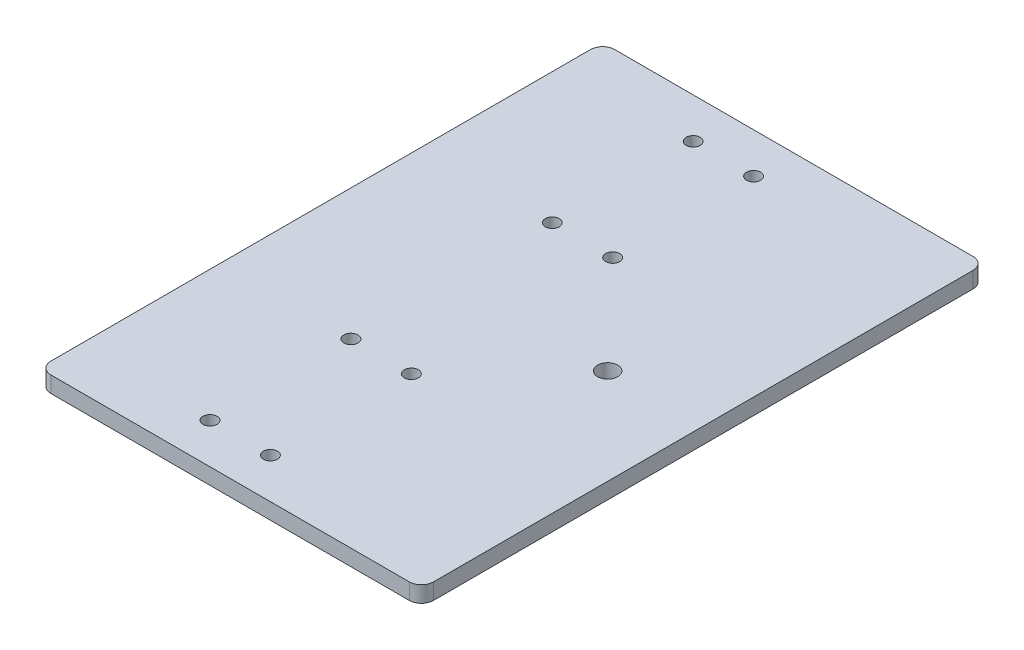
ISO-10303-21;
HEADER;
FILE_DESCRIPTION(('STEP AP214'),'2;1');
FILE_NAME('part.step','',(''),(''),'','','');
FILE_SCHEMA(('AUTOMOTIVE_DESIGN { 1 0 10303 214 1 1 1 1 }'));
ENDSEC;
DATA;
#1=APPLICATION_CONTEXT('core data for automotive mechanical design processes');
#2=APPLICATION_PROTOCOL_DEFINITION('international standard','automotive_design',2000,#1);
#3=PRODUCT_CONTEXT('',#1,'mechanical');
#4=PRODUCT('Part','Part','',(#3));
#5=PRODUCT_RELATED_PRODUCT_CATEGORY('part','',(#4));
#6=PRODUCT_DEFINITION_FORMATION('','',#4);
#7=PRODUCT_DEFINITION_CONTEXT('part definition',#1,'design');
#8=PRODUCT_DEFINITION('design','',#6,#7);
#9=PRODUCT_DEFINITION_SHAPE('','',#8);
#10=(LENGTH_UNIT() NAMED_UNIT(*) SI_UNIT(.MILLI.,.METRE.));
#11=(NAMED_UNIT(*) PLANE_ANGLE_UNIT() SI_UNIT($,.RADIAN.));
#12=(NAMED_UNIT(*) SI_UNIT($,.STERADIAN.) SOLID_ANGLE_UNIT());
#13=UNCERTAINTY_MEASURE_WITH_UNIT(LENGTH_MEASURE(1.E-05),#10,'distance_accuracy_value','');
#14=(GEOMETRIC_REPRESENTATION_CONTEXT(3) GLOBAL_UNCERTAINTY_ASSIGNED_CONTEXT((#13)) GLOBAL_UNIT_ASSIGNED_CONTEXT((#10,
#11,#12)) REPRESENTATION_CONTEXT('',''));
#15=CARTESIAN_POINT('',(0.,0.,0.));
#16=DIRECTION('',(0.,0.,1.));
#17=DIRECTION('',(1.,0.,0.));
#18=AXIS2_PLACEMENT_3D('',#15,#16,#17);
#19=CARTESIAN_POINT('',(0.,4.,0.));
#20=DIRECTION('',(0.,1.,0.));
#21=DIRECTION('',(0.,0.,1.));
#22=AXIS2_PLACEMENT_3D('',#19,#20,#21);
#23=PLANE('',#22);
#24=CARTESIAN_POINT('',(-14.9999999999996,4.,25.0000000000001));
#25=DIRECTION('',(0.,1.,0.));
#26=DIRECTION('',(0.,0.,-1.));
#27=AXIS2_PLACEMENT_3D('',#24,#25,#26);
#28=CIRCLE('',#27,1.75);
#29=CARTESIAN_POINT('',(-14.9999999999996,4.,23.2500000000001));
#30=VERTEX_POINT('',#29);
#31=EDGE_CURVE('E228',#30,#30,#28,.T.);
#32=ORIENTED_EDGE('',*,*,#31,.F.);
#33=EDGE_LOOP('',(#32));
#34=FACE_BOUND('',#33,.T.);
#35=CARTESIAN_POINT('',(-15.,4.,-59.9999999999999));
#36=DIRECTION('',(0.,1.,0.));
#37=DIRECTION('',(0.,0.,1.));
#38=AXIS2_PLACEMENT_3D('',#35,#36,#37);
#39=CIRCLE('',#38,1.75);
#40=CARTESIAN_POINT('',(-15.,4.,-58.2499999999999));
#41=VERTEX_POINT('',#40);
#42=EDGE_CURVE('E216',#41,#41,#39,.T.);
#43=ORIENTED_EDGE('',*,*,#42,.F.);
#44=EDGE_LOOP('',(#43));
#45=FACE_BOUND('',#44,.T.);
#46=CARTESIAN_POINT('',(0.,4.,60.));
#47=DIRECTION('',(0.,1.,0.));
#48=DIRECTION('',(0.,0.,-1.));
#49=AXIS2_PLACEMENT_3D('',#46,#47,#48);
#50=CIRCLE('',#49,1.75);
#51=CARTESIAN_POINT('',(0.,4.,58.25));
#52=VERTEX_POINT('',#51);
#53=EDGE_CURVE('E204',#52,#52,#50,.T.);
#54=ORIENTED_EDGE('',*,*,#53,.F.);
#55=EDGE_LOOP('',(#54));
#56=FACE_BOUND('',#55,.T.);
#57=CARTESIAN_POINT('',(3.64462408680021E-13,4.,-25.));
#58=DIRECTION('',(0.,1.,0.));
#59=DIRECTION('',(0.,0.,1.));
#60=AXIS2_PLACEMENT_3D('',#57,#58,#59);
#61=CIRCLE('',#60,1.75);
#62=CARTESIAN_POINT('',(3.64462408680021E-13,4.,-23.25));
#63=VERTEX_POINT('',#62);
#64=EDGE_CURVE('E193',#63,#63,#61,.T.);
#65=ORIENTED_EDGE('',*,*,#64,.F.);
#66=EDGE_LOOP('',(#65));
#67=FACE_BOUND('',#66,.T.);
#68=DIRECTION('',(-1.,0.,0.));
#69=VECTOR('',#68,1.);
#70=CARTESIAN_POINT('',(-47.5,4.,-70.));
#71=LINE('',#70,#69);
#72=CARTESIAN_POINT('',(44.5,4.,-70.));
#73=VERTEX_POINT('',#72);
#74=CARTESIAN_POINT('',(-44.5,4.,-70.));
#75=VERTEX_POINT('',#74);
#76=EDGE_CURVE('E179',#73,#75,#71,.T.);
#77=ORIENTED_EDGE('',*,*,#76,.T.);
#78=CARTESIAN_POINT('',(-44.5,4.,-67.));
#79=DIRECTION('',(0.,1.,0.));
#80=DIRECTION('',(0.,0.,1.));
#81=AXIS2_PLACEMENT_3D('',#78,#79,#80);
#82=CIRCLE('',#81,3.);
#83=CARTESIAN_POINT('',(-47.5,4.,-67.));
#84=VERTEX_POINT('',#83);
#85=EDGE_CURVE('E157',#75,#84,#82,.T.);
#86=ORIENTED_EDGE('',*,*,#85,.T.);
#87=DIRECTION('',(0.,0.,1.));
#88=VECTOR('',#87,1.);
#89=CARTESIAN_POINT('',(-47.5,4.,-70.));
#90=LINE('',#89,#88);
#91=CARTESIAN_POINT('',(-47.5,4.,67.));
#92=VERTEX_POINT('',#91);
#93=EDGE_CURVE('E127',#84,#92,#90,.T.);
#94=ORIENTED_EDGE('',*,*,#93,.T.);
#95=CARTESIAN_POINT('',(-44.5,4.,67.));
#96=DIRECTION('',(0.,1.,0.));
#97=DIRECTION('',(0.,0.,1.));
#98=AXIS2_PLACEMENT_3D('',#95,#96,#97);
#99=CIRCLE('',#98,3.);
#100=CARTESIAN_POINT('',(-44.5,4.,70.));
#101=VERTEX_POINT('',#100);
#102=EDGE_CURVE('E63',#92,#101,#99,.T.);
#103=ORIENTED_EDGE('',*,*,#102,.T.);
#104=DIRECTION('',(1.,0.,0.));
#105=VECTOR('',#104,1.);
#106=CARTESIAN_POINT('',(-47.5,4.,70.));
#107=LINE('',#106,#105);
#108=CARTESIAN_POINT('',(44.5,4.,70.));
#109=VERTEX_POINT('',#108);
#110=EDGE_CURVE('E143',#101,#109,#107,.T.);
#111=ORIENTED_EDGE('',*,*,#110,.T.);
#112=CARTESIAN_POINT('',(44.5,4.,67.));
#113=DIRECTION('',(0.,1.,0.));
#114=DIRECTION('',(0.,0.,1.));
#115=AXIS2_PLACEMENT_3D('',#112,#113,#114);
#116=CIRCLE('',#115,3.);
#117=CARTESIAN_POINT('',(47.5,4.,67.));
#118=VERTEX_POINT('',#117);
#119=EDGE_CURVE('E153',#109,#118,#116,.T.);
#120=ORIENTED_EDGE('',*,*,#119,.T.);
#121=DIRECTION('',(0.,0.,-1.));
#122=VECTOR('',#121,1.);
#123=CARTESIAN_POINT('',(47.5,4.,-70.));
#124=LINE('',#123,#122);
#125=CARTESIAN_POINT('',(47.5,4.,-67.));
#126=VERTEX_POINT('',#125);
#127=EDGE_CURVE('E137',#118,#126,#124,.T.);
#128=ORIENTED_EDGE('',*,*,#127,.T.);
#129=CARTESIAN_POINT('',(44.5,4.,-67.));
#130=DIRECTION('',(0.,1.,0.));
#131=DIRECTION('',(0.,0.,1.));
#132=AXIS2_PLACEMENT_3D('',#129,#130,#131);
#133=CIRCLE('',#132,3.);
#134=EDGE_CURVE('E155',#126,#73,#133,.T.);
#135=ORIENTED_EDGE('',*,*,#134,.T.);
#136=EDGE_LOOP('',(#77,#86,#94,#103,#111,#120,#128,#135));
#137=FACE_BOUND('',#136,.T.);
#138=CARTESIAN_POINT('',(0.,4.,-60.));
#139=DIRECTION('',(0.,1.,0.));
#140=DIRECTION('',(0.,0.,1.));
#141=AXIS2_PLACEMENT_3D('',#138,#139,#140);
#142=CIRCLE('',#141,1.75);
#143=CARTESIAN_POINT('',(0.,4.,-58.25));
#144=VERTEX_POINT('',#143);
#145=EDGE_CURVE('E188',#144,#144,#142,.T.);
#146=ORIENTED_EDGE('',*,*,#145,.F.);
#147=EDGE_LOOP('',(#146));
#148=FACE_BOUND('',#147,.T.);
#149=CARTESIAN_POINT('',(3.64462408680021E-13,4.,25.));
#150=DIRECTION('',(0.,1.,0.));
#151=DIRECTION('',(0.,0.,-1.));
#152=AXIS2_PLACEMENT_3D('',#149,#150,#151);
#153=CIRCLE('',#152,1.75);
#154=CARTESIAN_POINT('',(3.64462408680021E-13,4.,23.25));
#155=VERTEX_POINT('',#154);
#156=EDGE_CURVE('E198',#155,#155,#153,.T.);
#157=ORIENTED_EDGE('',*,*,#156,.F.);
#158=EDGE_LOOP('',(#157));
#159=FACE_BOUND('',#158,.T.);
#160=CARTESIAN_POINT('',(23.75,4.,0.));
#161=DIRECTION('',(0.,1.,0.));
#162=DIRECTION('',(0.,0.,1.));
#163=AXIS2_PLACEMENT_3D('',#160,#161,#162);
#164=CIRCLE('',#163,2.5);
#165=CARTESIAN_POINT('',(23.75,4.,2.5));
#166=VERTEX_POINT('',#165);
#167=EDGE_CURVE('E210',#166,#166,#164,.T.);
#168=ORIENTED_EDGE('',*,*,#167,.F.);
#169=EDGE_LOOP('',(#168));
#170=FACE_BOUND('',#169,.T.);
#171=CARTESIAN_POINT('',(-14.9999999999996,4.,-24.9999999999999));
#172=DIRECTION('',(0.,1.,0.));
#173=DIRECTION('',(0.,0.,1.));
#174=AXIS2_PLACEMENT_3D('',#171,#172,#173);
#175=CIRCLE('',#174,1.75);
#176=CARTESIAN_POINT('',(-14.9999999999996,4.,-23.2499999999999));
#177=VERTEX_POINT('',#176);
#178=EDGE_CURVE('E222',#177,#177,#175,.T.);
#179=ORIENTED_EDGE('',*,*,#178,.F.);
#180=EDGE_LOOP('',(#179));
#181=FACE_BOUND('',#180,.T.);
#182=CARTESIAN_POINT('',(-15.,4.,60.0000000000001));
#183=DIRECTION('',(0.,1.,0.));
#184=DIRECTION('',(0.,0.,-1.));
#185=AXIS2_PLACEMENT_3D('',#182,#183,#184);
#186=CIRCLE('',#185,1.75);
#187=CARTESIAN_POINT('',(-15.,4.,58.2500000000001));
#188=VERTEX_POINT('',#187);
#189=EDGE_CURVE('E234',#188,#188,#186,.T.);
#190=ORIENTED_EDGE('',*,*,#189,.F.);
#191=EDGE_LOOP('',(#190));
#192=FACE_BOUND('',#191,.T.);
#193=ADVANCED_FACE('F43',(#34,#45,#56,#67,#137,#148,#159,#170,#181,#192),#23,.T.);
#194=CARTESIAN_POINT('',(0.,0.,0.));
#195=DIRECTION('',(0.,1.,0.));
#196=DIRECTION('',(0.,0.,1.));
#197=AXIS2_PLACEMENT_3D('',#194,#195,#196);
#198=PLANE('',#197);
#199=DIRECTION('',(0.,0.,1.));
#200=VECTOR('',#199,1.);
#201=CARTESIAN_POINT('',(-47.5,0.,-70.));
#202=LINE('',#201,#200);
#203=CARTESIAN_POINT('',(-47.5,0.,-67.));
#204=VERTEX_POINT('',#203);
#205=CARTESIAN_POINT('',(-47.5,0.,67.));
#206=VERTEX_POINT('',#205);
#207=EDGE_CURVE('E125',#204,#206,#202,.T.);
#208=ORIENTED_EDGE('',*,*,#207,.F.);
#209=CARTESIAN_POINT('',(-44.5,0.,-67.));
#210=DIRECTION('',(0.,1.,0.));
#211=DIRECTION('',(0.,0.,1.));
#212=AXIS2_PLACEMENT_3D('',#209,#210,#211);
#213=CIRCLE('',#212,3.);
#214=CARTESIAN_POINT('',(-44.5,0.,-70.));
#215=VERTEX_POINT('',#214);
#216=EDGE_CURVE('E108',#204,#215,#213,.F.);
#217=ORIENTED_EDGE('',*,*,#216,.T.);
#218=DIRECTION('',(-1.,0.,0.));
#219=VECTOR('',#218,1.);
#220=CARTESIAN_POINT('',(-47.5,0.,-70.));
#221=LINE('',#220,#219);
#222=CARTESIAN_POINT('',(44.5,0.,-70.));
#223=VERTEX_POINT('',#222);
#224=EDGE_CURVE('E135',#223,#215,#221,.T.);
#225=ORIENTED_EDGE('',*,*,#224,.F.);
#226=CARTESIAN_POINT('',(44.5,0.,-67.));
#227=DIRECTION('',(0.,1.,0.));
#228=DIRECTION('',(0.,0.,1.));
#229=AXIS2_PLACEMENT_3D('',#226,#227,#228);
#230=CIRCLE('',#229,3.);
#231=CARTESIAN_POINT('',(47.5,0.,-67.));
#232=VERTEX_POINT('',#231);
#233=EDGE_CURVE('E119',#223,#232,#230,.F.);
#234=ORIENTED_EDGE('',*,*,#233,.T.);
#235=DIRECTION('',(0.,0.,-1.));
#236=VECTOR('',#235,1.);
#237=CARTESIAN_POINT('',(47.5,0.,-70.));
#238=LINE('',#237,#236);
#239=CARTESIAN_POINT('',(47.5,0.,67.));
#240=VERTEX_POINT('',#239);
#241=EDGE_CURVE('E139',#240,#232,#238,.T.);
#242=ORIENTED_EDGE('',*,*,#241,.F.);
#243=CARTESIAN_POINT('',(44.5,0.,67.));
#244=DIRECTION('',(0.,1.,0.));
#245=DIRECTION('',(0.,0.,1.));
#246=AXIS2_PLACEMENT_3D('',#243,#244,#245);
#247=CIRCLE('',#246,3.);
#248=CARTESIAN_POINT('',(44.5,0.,70.));
#249=VERTEX_POINT('',#248);
#250=EDGE_CURVE('E146',#240,#249,#247,.F.);
#251=ORIENTED_EDGE('',*,*,#250,.T.);
#252=DIRECTION('',(1.,0.,0.));
#253=VECTOR('',#252,1.);
#254=CARTESIAN_POINT('',(-47.5,0.,70.));
#255=LINE('',#254,#253);
#256=CARTESIAN_POINT('',(-44.5,0.,70.));
#257=VERTEX_POINT('',#256);
#258=EDGE_CURVE('E134',#257,#249,#255,.T.);
#259=ORIENTED_EDGE('',*,*,#258,.F.);
#260=CARTESIAN_POINT('',(-44.5,0.,67.));
#261=DIRECTION('',(0.,1.,0.));
#262=DIRECTION('',(0.,0.,1.));
#263=AXIS2_PLACEMENT_3D('',#260,#261,#262);
#264=CIRCLE('',#263,3.);
#265=EDGE_CURVE('E128',#257,#206,#264,.F.);
#266=ORIENTED_EDGE('',*,*,#265,.T.);
#267=EDGE_LOOP('',(#208,#217,#225,#234,#242,#251,#259,#266));
#268=FACE_BOUND('',#267,.T.);
#269=CARTESIAN_POINT('',(0.,0.,-60.));
#270=DIRECTION('',(0.,1.,0.));
#271=DIRECTION('',(0.,0.,1.));
#272=AXIS2_PLACEMENT_3D('',#269,#270,#271);
#273=CIRCLE('',#272,1.75);
#274=CARTESIAN_POINT('',(0.,0.,-58.25));
#275=VERTEX_POINT('',#274);
#276=EDGE_CURVE('E184',#275,#275,#273,.T.);
#277=ORIENTED_EDGE('',*,*,#276,.T.);
#278=EDGE_LOOP('',(#277));
#279=FACE_BOUND('',#278,.T.);
#280=CARTESIAN_POINT('',(3.64462408680021E-13,0.,-25.));
#281=DIRECTION('',(0.,1.,0.));
#282=DIRECTION('',(0.,0.,1.));
#283=AXIS2_PLACEMENT_3D('',#280,#281,#282);
#284=CIRCLE('',#283,1.75);
#285=CARTESIAN_POINT('',(3.64462408680021E-13,0.,-23.25));
#286=VERTEX_POINT('',#285);
#287=EDGE_CURVE('E195',#286,#286,#284,.T.);
#288=ORIENTED_EDGE('',*,*,#287,.T.);
#289=EDGE_LOOP('',(#288));
#290=FACE_BOUND('',#289,.T.);
#291=CARTESIAN_POINT('',(3.64462408680021E-13,0.,25.));
#292=DIRECTION('',(0.,1.,0.));
#293=DIRECTION('',(0.,0.,-1.));
#294=AXIS2_PLACEMENT_3D('',#291,#292,#293);
#295=CIRCLE('',#294,1.75);
#296=CARTESIAN_POINT('',(3.64462408680021E-13,0.,23.25));
#297=VERTEX_POINT('',#296);
#298=EDGE_CURVE('E201',#297,#297,#295,.T.);
#299=ORIENTED_EDGE('',*,*,#298,.T.);
#300=EDGE_LOOP('',(#299));
#301=FACE_BOUND('',#300,.T.);
#302=CARTESIAN_POINT('',(0.,0.,60.));
#303=DIRECTION('',(0.,1.,0.));
#304=DIRECTION('',(0.,0.,-1.));
#305=AXIS2_PLACEMENT_3D('',#302,#303,#304);
#306=CIRCLE('',#305,1.75);
#307=CARTESIAN_POINT('',(0.,0.,58.25));
#308=VERTEX_POINT('',#307);
#309=EDGE_CURVE('E207',#308,#308,#306,.T.);
#310=ORIENTED_EDGE('',*,*,#309,.T.);
#311=EDGE_LOOP('',(#310));
#312=FACE_BOUND('',#311,.T.);
#313=CARTESIAN_POINT('',(23.75,0.,0.));
#314=DIRECTION('',(0.,1.,0.));
#315=DIRECTION('',(0.,0.,1.));
#316=AXIS2_PLACEMENT_3D('',#313,#314,#315);
#317=CIRCLE('',#316,2.5);
#318=CARTESIAN_POINT('',(23.75,0.,2.5));
#319=VERTEX_POINT('',#318);
#320=EDGE_CURVE('E213',#319,#319,#317,.T.);
#321=ORIENTED_EDGE('',*,*,#320,.T.);
#322=EDGE_LOOP('',(#321));
#323=FACE_BOUND('',#322,.T.);
#324=CARTESIAN_POINT('',(-15.,0.,-59.9999999999999));
#325=DIRECTION('',(0.,1.,0.));
#326=DIRECTION('',(0.,0.,1.));
#327=AXIS2_PLACEMENT_3D('',#324,#325,#326);
#328=CIRCLE('',#327,1.75);
#329=CARTESIAN_POINT('',(-15.,0.,-58.2499999999999));
#330=VERTEX_POINT('',#329);
#331=EDGE_CURVE('E219',#330,#330,#328,.T.);
#332=ORIENTED_EDGE('',*,*,#331,.T.);
#333=EDGE_LOOP('',(#332));
#334=FACE_BOUND('',#333,.T.);
#335=CARTESIAN_POINT('',(-14.9999999999996,0.,-24.9999999999999));
#336=DIRECTION('',(0.,1.,0.));
#337=DIRECTION('',(0.,0.,1.));
#338=AXIS2_PLACEMENT_3D('',#335,#336,#337);
#339=CIRCLE('',#338,1.75);
#340=CARTESIAN_POINT('',(-14.9999999999996,0.,-23.2499999999999));
#341=VERTEX_POINT('',#340);
#342=EDGE_CURVE('E225',#341,#341,#339,.T.);
#343=ORIENTED_EDGE('',*,*,#342,.T.);
#344=EDGE_LOOP('',(#343));
#345=FACE_BOUND('',#344,.T.);
#346=CARTESIAN_POINT('',(-14.9999999999996,0.,25.0000000000001));
#347=DIRECTION('',(0.,1.,0.));
#348=DIRECTION('',(0.,0.,-1.));
#349=AXIS2_PLACEMENT_3D('',#346,#347,#348);
#350=CIRCLE('',#349,1.75);
#351=CARTESIAN_POINT('',(-14.9999999999996,0.,23.2500000000001));
#352=VERTEX_POINT('',#351);
#353=EDGE_CURVE('E231',#352,#352,#350,.T.);
#354=ORIENTED_EDGE('',*,*,#353,.T.);
#355=EDGE_LOOP('',(#354));
#356=FACE_BOUND('',#355,.T.);
#357=CARTESIAN_POINT('',(-15.,0.,60.0000000000001));
#358=DIRECTION('',(0.,1.,0.));
#359=DIRECTION('',(0.,0.,-1.));
#360=AXIS2_PLACEMENT_3D('',#357,#358,#359);
#361=CIRCLE('',#360,1.75);
#362=CARTESIAN_POINT('',(-15.,0.,58.2500000000001));
#363=VERTEX_POINT('',#362);
#364=EDGE_CURVE('E237',#363,#363,#361,.T.);
#365=ORIENTED_EDGE('',*,*,#364,.T.);
#366=EDGE_LOOP('',(#365));
#367=FACE_BOUND('',#366,.T.);
#368=ADVANCED_FACE('F131',(#268,#279,#290,#301,#312,#323,#334,#345,#356,#367),#198,.F.);
#369=CARTESIAN_POINT('',(47.5,4.,-70.));
#370=DIRECTION('',(-1.,0.,0.));
#371=DIRECTION('',(0.,0.,1.));
#372=AXIS2_PLACEMENT_3D('',#369,#370,#371);
#373=PLANE('',#372);
#374=ORIENTED_EDGE('',*,*,#241,.T.);
#375=DIRECTION('',(0.,-1.,0.));
#376=VECTOR('',#375,1.);
#377=CARTESIAN_POINT('',(47.5,4.,-67.));
#378=LINE('',#377,#376);
#379=EDGE_CURVE('E162',#232,#126,#378,.F.);
#380=ORIENTED_EDGE('',*,*,#379,.T.);
#381=ORIENTED_EDGE('',*,*,#127,.F.);
#382=DIRECTION('',(0.,-1.,0.));
#383=VECTOR('',#382,1.);
#384=CARTESIAN_POINT('',(47.5,4.,67.));
#385=LINE('',#384,#383);
#386=EDGE_CURVE('E159',#118,#240,#385,.T.);
#387=ORIENTED_EDGE('',*,*,#386,.T.);
#388=EDGE_LOOP('',(#374,#380,#381,#387));
#389=FACE_BOUND('',#388,.T.);
#390=ADVANCED_FACE('F175',(#389),#373,.F.);
#391=CARTESIAN_POINT('',(-47.5,4.,-70.));
#392=DIRECTION('',(0.,0.,1.));
#393=DIRECTION('',(1.,0.,0.));
#394=AXIS2_PLACEMENT_3D('',#391,#392,#393);
#395=PLANE('',#394);
#396=ORIENTED_EDGE('',*,*,#224,.T.);
#397=DIRECTION('',(0.,-1.,0.));
#398=VECTOR('',#397,1.);
#399=CARTESIAN_POINT('',(-44.5,4.,-70.));
#400=LINE('',#399,#398);
#401=EDGE_CURVE('E113',#215,#75,#400,.F.);
#402=ORIENTED_EDGE('',*,*,#401,.T.);
#403=ORIENTED_EDGE('',*,*,#76,.F.);
#404=DIRECTION('',(0.,-1.,0.));
#405=VECTOR('',#404,1.);
#406=CARTESIAN_POINT('',(44.5,4.,-70.));
#407=LINE('',#406,#405);
#408=EDGE_CURVE('E118',#73,#223,#407,.T.);
#409=ORIENTED_EDGE('',*,*,#408,.T.);
#410=EDGE_LOOP('',(#396,#402,#403,#409));
#411=FACE_BOUND('',#410,.T.);
#412=ADVANCED_FACE('F263',(#411),#395,.F.);
#413=CARTESIAN_POINT('',(-47.5,4.,-70.));
#414=DIRECTION('',(1.,0.,0.));
#415=DIRECTION('',(0.,0.,-1.));
#416=AXIS2_PLACEMENT_3D('',#413,#414,#415);
#417=PLANE('',#416);
#418=ORIENTED_EDGE('',*,*,#93,.F.);
#419=DIRECTION('',(0.,-1.,0.));
#420=VECTOR('',#419,1.);
#421=CARTESIAN_POINT('',(-47.5,4.,-67.));
#422=LINE('',#421,#420);
#423=EDGE_CURVE('E112',#84,#204,#422,.T.);
#424=ORIENTED_EDGE('',*,*,#423,.T.);
#425=ORIENTED_EDGE('',*,*,#207,.T.);
#426=DIRECTION('',(0.,-1.,0.));
#427=VECTOR('',#426,1.);
#428=CARTESIAN_POINT('',(-47.5,4.,67.));
#429=LINE('',#428,#427);
#430=EDGE_CURVE('E129',#206,#92,#429,.F.);
#431=ORIENTED_EDGE('',*,*,#430,.T.);
#432=EDGE_LOOP('',(#418,#424,#425,#431));
#433=FACE_BOUND('',#432,.T.);
#434=ADVANCED_FACE('F124',(#433),#417,.F.);
#435=CARTESIAN_POINT('',(-47.5,4.,70.));
#436=DIRECTION('',(0.,0.,-1.));
#437=DIRECTION('',(-1.,0.,0.));
#438=AXIS2_PLACEMENT_3D('',#435,#436,#437);
#439=PLANE('',#438);
#440=ORIENTED_EDGE('',*,*,#258,.T.);
#441=DIRECTION('',(0.,-1.,0.));
#442=VECTOR('',#441,1.);
#443=CARTESIAN_POINT('',(44.5,4.,70.));
#444=LINE('',#443,#442);
#445=EDGE_CURVE('E11',#249,#109,#444,.F.);
#446=ORIENTED_EDGE('',*,*,#445,.T.);
#447=ORIENTED_EDGE('',*,*,#110,.F.);
#448=DIRECTION('',(0.,-1.,0.));
#449=VECTOR('',#448,1.);
#450=CARTESIAN_POINT('',(-44.5,4.,70.));
#451=LINE('',#450,#449);
#452=EDGE_CURVE('E51',#101,#257,#451,.T.);
#453=ORIENTED_EDGE('',*,*,#452,.T.);
#454=EDGE_LOOP('',(#440,#446,#447,#453));
#455=FACE_BOUND('',#454,.T.);
#456=ADVANCED_FACE('F165',(#455),#439,.F.);
#457=CARTESIAN_POINT('',(0.,4.,-60.));
#458=DIRECTION('',(0.,-1.,0.));
#459=DIRECTION('',(0.,0.,-1.));
#460=AXIS2_PLACEMENT_3D('',#457,#458,#459);
#461=CYLINDRICAL_SURFACE('',#460,1.75);
#462=ORIENTED_EDGE('',*,*,#145,.T.);
#463=EDGE_LOOP('',(#462));
#464=FACE_BOUND('',#463,.T.);
#465=ORIENTED_EDGE('',*,*,#276,.F.);
#466=EDGE_LOOP('',(#465));
#467=FACE_BOUND('',#466,.T.);
#468=ADVANCED_FACE('F256',(#464,#467),#461,.F.);
#469=CARTESIAN_POINT('',(3.64462408680021E-13,4.,-25.));
#470=DIRECTION('',(0.,-1.,0.));
#471=DIRECTION('',(0.,0.,-1.));
#472=AXIS2_PLACEMENT_3D('',#469,#470,#471);
#473=CYLINDRICAL_SURFACE('',#472,1.75);
#474=ORIENTED_EDGE('',*,*,#64,.T.);
#475=EDGE_LOOP('',(#474));
#476=FACE_BOUND('',#475,.T.);
#477=ORIENTED_EDGE('',*,*,#287,.F.);
#478=EDGE_LOOP('',(#477));
#479=FACE_BOUND('',#478,.T.);
#480=ADVANCED_FACE('F323',(#476,#479),#473,.F.);
#481=CARTESIAN_POINT('',(3.64462408680021E-13,4.,25.));
#482=DIRECTION('',(0.,-1.,0.));
#483=DIRECTION('',(0.,0.,-1.));
#484=AXIS2_PLACEMENT_3D('',#481,#482,#483);
#485=CYLINDRICAL_SURFACE('',#484,1.75);
#486=ORIENTED_EDGE('',*,*,#156,.T.);
#487=EDGE_LOOP('',(#486));
#488=FACE_BOUND('',#487,.T.);
#489=ORIENTED_EDGE('',*,*,#298,.F.);
#490=EDGE_LOOP('',(#489));
#491=FACE_BOUND('',#490,.T.);
#492=ADVANCED_FACE('F320',(#488,#491),#485,.F.);
#493=CARTESIAN_POINT('',(0.,4.,60.));
#494=DIRECTION('',(0.,-1.,0.));
#495=DIRECTION('',(0.,0.,-1.));
#496=AXIS2_PLACEMENT_3D('',#493,#494,#495);
#497=CYLINDRICAL_SURFACE('',#496,1.75);
#498=ORIENTED_EDGE('',*,*,#53,.T.);
#499=EDGE_LOOP('',(#498));
#500=FACE_BOUND('',#499,.T.);
#501=ORIENTED_EDGE('',*,*,#309,.F.);
#502=EDGE_LOOP('',(#501));
#503=FACE_BOUND('',#502,.T.);
#504=ADVANCED_FACE('F316',(#500,#503),#497,.F.);
#505=CARTESIAN_POINT('',(23.75,4.,0.));
#506=DIRECTION('',(0.,-1.,0.));
#507=DIRECTION('',(0.,0.,-1.));
#508=AXIS2_PLACEMENT_3D('',#505,#506,#507);
#509=CYLINDRICAL_SURFACE('',#508,2.5);
#510=ORIENTED_EDGE('',*,*,#167,.T.);
#511=EDGE_LOOP('',(#510));
#512=FACE_BOUND('',#511,.T.);
#513=ORIENTED_EDGE('',*,*,#320,.F.);
#514=EDGE_LOOP('',(#513));
#515=FACE_BOUND('',#514,.T.);
#516=ADVANCED_FACE('F312',(#512,#515),#509,.F.);
#517=CARTESIAN_POINT('',(-15.,4.,-59.9999999999999));
#518=DIRECTION('',(0.,-1.,0.));
#519=DIRECTION('',(0.,0.,-1.));
#520=AXIS2_PLACEMENT_3D('',#517,#518,#519);
#521=CYLINDRICAL_SURFACE('',#520,1.75);
#522=ORIENTED_EDGE('',*,*,#42,.T.);
#523=EDGE_LOOP('',(#522));
#524=FACE_BOUND('',#523,.T.);
#525=ORIENTED_EDGE('',*,*,#331,.F.);
#526=EDGE_LOOP('',(#525));
#527=FACE_BOUND('',#526,.T.);
#528=ADVANCED_FACE('F294',(#524,#527),#521,.F.);
#529=CARTESIAN_POINT('',(-14.9999999999996,4.,-24.9999999999999));
#530=DIRECTION('',(0.,-1.,0.));
#531=DIRECTION('',(0.,0.,-1.));
#532=AXIS2_PLACEMENT_3D('',#529,#530,#531);
#533=CYLINDRICAL_SURFACE('',#532,1.75);
#534=ORIENTED_EDGE('',*,*,#178,.T.);
#535=EDGE_LOOP('',(#534));
#536=FACE_BOUND('',#535,.T.);
#537=ORIENTED_EDGE('',*,*,#342,.F.);
#538=EDGE_LOOP('',(#537));
#539=FACE_BOUND('',#538,.T.);
#540=ADVANCED_FACE('F290',(#536,#539),#533,.F.);
#541=CARTESIAN_POINT('',(-14.9999999999996,4.,25.0000000000001));
#542=DIRECTION('',(0.,-1.,0.));
#543=DIRECTION('',(0.,0.,-1.));
#544=AXIS2_PLACEMENT_3D('',#541,#542,#543);
#545=CYLINDRICAL_SURFACE('',#544,1.75);
#546=ORIENTED_EDGE('',*,*,#31,.T.);
#547=EDGE_LOOP('',(#546));
#548=FACE_BOUND('',#547,.T.);
#549=ORIENTED_EDGE('',*,*,#353,.F.);
#550=EDGE_LOOP('',(#549));
#551=FACE_BOUND('',#550,.T.);
#552=ADVANCED_FACE('F293',(#548,#551),#545,.F.);
#553=CARTESIAN_POINT('',(-15.,4.,60.0000000000001));
#554=DIRECTION('',(0.,-1.,0.));
#555=DIRECTION('',(0.,0.,-1.));
#556=AXIS2_PLACEMENT_3D('',#553,#554,#555);
#557=CYLINDRICAL_SURFACE('',#556,1.75);
#558=ORIENTED_EDGE('',*,*,#189,.T.);
#559=EDGE_LOOP('',(#558));
#560=FACE_BOUND('',#559,.T.);
#561=ORIENTED_EDGE('',*,*,#364,.F.);
#562=EDGE_LOOP('',(#561));
#563=FACE_BOUND('',#562,.T.);
#564=ADVANCED_FACE('F243',(#560,#563),#557,.F.);
#565=CARTESIAN_POINT('',(-44.5,4.,-67.));
#566=DIRECTION('',(0.,-1.,0.));
#567=DIRECTION('',(0.,0.,-1.));
#568=AXIS2_PLACEMENT_3D('',#565,#566,#567);
#569=CYLINDRICAL_SURFACE('',#568,3.);
#570=ORIENTED_EDGE('',*,*,#85,.F.);
#571=ORIENTED_EDGE('',*,*,#401,.F.);
#572=ORIENTED_EDGE('',*,*,#216,.F.);
#573=ORIENTED_EDGE('',*,*,#423,.F.);
#574=EDGE_LOOP('',(#570,#571,#572,#573));
#575=FACE_BOUND('',#574,.T.);
#576=ADVANCED_FACE('F111',(#575),#569,.T.);
#577=CARTESIAN_POINT('',(44.5,4.,-67.));
#578=DIRECTION('',(0.,-1.,0.));
#579=DIRECTION('',(0.,0.,-1.));
#580=AXIS2_PLACEMENT_3D('',#577,#578,#579);
#581=CYLINDRICAL_SURFACE('',#580,3.);
#582=ORIENTED_EDGE('',*,*,#134,.F.);
#583=ORIENTED_EDGE('',*,*,#379,.F.);
#584=ORIENTED_EDGE('',*,*,#233,.F.);
#585=ORIENTED_EDGE('',*,*,#408,.F.);
#586=EDGE_LOOP('',(#582,#583,#584,#585));
#587=FACE_BOUND('',#586,.T.);
#588=ADVANCED_FACE('F271',(#587),#581,.T.);
#589=CARTESIAN_POINT('',(44.5,4.,67.));
#590=DIRECTION('',(0.,-1.,0.));
#591=DIRECTION('',(0.,0.,-1.));
#592=AXIS2_PLACEMENT_3D('',#589,#590,#591);
#593=CYLINDRICAL_SURFACE('',#592,3.);
#594=ORIENTED_EDGE('',*,*,#119,.F.);
#595=ORIENTED_EDGE('',*,*,#445,.F.);
#596=ORIENTED_EDGE('',*,*,#250,.F.);
#597=ORIENTED_EDGE('',*,*,#386,.F.);
#598=EDGE_LOOP('',(#594,#595,#596,#597));
#599=FACE_BOUND('',#598,.T.);
#600=ADVANCED_FACE('F172',(#599),#593,.T.);
#601=CARTESIAN_POINT('',(-44.5,4.,67.));
#602=DIRECTION('',(0.,-1.,0.));
#603=DIRECTION('',(0.,0.,-1.));
#604=AXIS2_PLACEMENT_3D('',#601,#602,#603);
#605=CYLINDRICAL_SURFACE('',#604,3.);
#606=ORIENTED_EDGE('',*,*,#102,.F.);
#607=ORIENTED_EDGE('',*,*,#430,.F.);
#608=ORIENTED_EDGE('',*,*,#265,.F.);
#609=ORIENTED_EDGE('',*,*,#452,.F.);
#610=EDGE_LOOP('',(#606,#607,#608,#609));
#611=FACE_BOUND('',#610,.T.);
#612=ADVANCED_FACE('F45',(#611),#605,.T.);
#613=CLOSED_SHELL('',(#193,#368,#390,#412,#434,#456,#468,#480,#492,#504,#516,#528,#540,#552,
#564,#576,#588,#600,#612));
#614=MANIFOLD_SOLID_BREP('B2',#613);
#615=ADVANCED_BREP_SHAPE_REPRESENTATION('',(#18,#614),#14);
#616=SHAPE_DEFINITION_REPRESENTATION(#9,#615);
ENDSEC;
END-ISO-10303-21;
